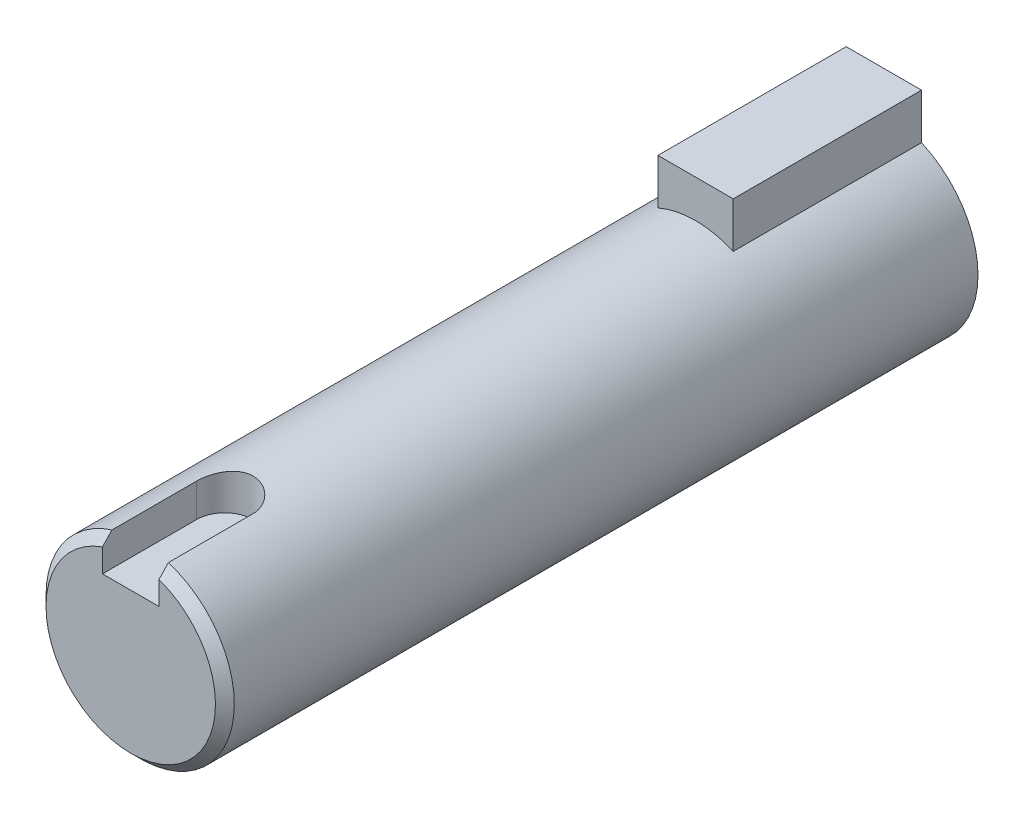
ISO-10303-21;
HEADER;
FILE_DESCRIPTION(('STEP AP214'),'2;1');
FILE_NAME('part.step','',(''),(''),'','','');
FILE_SCHEMA(('AUTOMOTIVE_DESIGN { 1 0 10303 214 1 1 1 1 }'));
ENDSEC;
DATA;
#1=APPLICATION_CONTEXT('core data for automotive mechanical design processes');
#2=APPLICATION_PROTOCOL_DEFINITION('international standard','automotive_design',2000,#1);
#3=PRODUCT_CONTEXT('',#1,'mechanical');
#4=PRODUCT('Part','Part','',(#3));
#5=PRODUCT_RELATED_PRODUCT_CATEGORY('part','',(#4));
#6=PRODUCT_DEFINITION_FORMATION('','',#4);
#7=PRODUCT_DEFINITION_CONTEXT('part definition',#1,'design');
#8=PRODUCT_DEFINITION('design','',#6,#7);
#9=PRODUCT_DEFINITION_SHAPE('','',#8);
#10=(LENGTH_UNIT() NAMED_UNIT(*) SI_UNIT(.MILLI.,.METRE.));
#11=(NAMED_UNIT(*) PLANE_ANGLE_UNIT() SI_UNIT($,.RADIAN.));
#12=(NAMED_UNIT(*) SI_UNIT($,.STERADIAN.) SOLID_ANGLE_UNIT());
#13=UNCERTAINTY_MEASURE_WITH_UNIT(LENGTH_MEASURE(1.E-05),#10,'distance_accuracy_value','');
#14=(GEOMETRIC_REPRESENTATION_CONTEXT(3) GLOBAL_UNCERTAINTY_ASSIGNED_CONTEXT((#13)) GLOBAL_UNIT_ASSIGNED_CONTEXT((#10,
#11,#12)) REPRESENTATION_CONTEXT('',''));
#15=CARTESIAN_POINT('',(0.,0.,0.));
#16=DIRECTION('',(0.,0.,1.));
#17=DIRECTION('',(1.,0.,0.));
#18=AXIS2_PLACEMENT_3D('',#15,#16,#17);
#19=CARTESIAN_POINT('',(0.,0.,10.));
#20=DIRECTION('',(0.,0.,-1.));
#21=DIRECTION('',(-1.,0.,0.));
#22=AXIS2_PLACEMENT_3D('',#19,#20,#21);
#23=CYLINDRICAL_SURFACE('',#22,5.);
#24=CARTESIAN_POINT('',(0.,0.,0.));
#25=DIRECTION('',(0.,0.,1.));
#26=DIRECTION('',(1.,0.,0.));
#27=AXIS2_PLACEMENT_3D('',#24,#25,#26);
#28=CIRCLE('',#27,5.);
#29=CARTESIAN_POINT('',(-2.,4.58257569495584,0.));
#30=VERTEX_POINT('',#29);
#31=CARTESIAN_POINT('',(2.,4.58257569495584,0.));
#32=VERTEX_POINT('',#31);
#33=EDGE_CURVE('E167',#30,#32,#28,.T.);
#34=ORIENTED_EDGE('',*,*,#33,.T.);
#35=DIRECTION('',(0.,0.,-1.));
#36=VECTOR('',#35,1.);
#37=CARTESIAN_POINT('',(2.,4.58257569495584,10.));
#38=LINE('',#37,#36);
#39=CARTESIAN_POINT('',(2.,4.58257569495584,10.));
#40=VERTEX_POINT('',#39);
#41=EDGE_CURVE('E177',#40,#32,#38,.T.);
#42=ORIENTED_EDGE('',*,*,#41,.F.);
#43=CARTESIAN_POINT('',(0.,0.,10.));
#44=DIRECTION('',(0.,0.,1.));
#45=DIRECTION('',(1.,0.,0.));
#46=AXIS2_PLACEMENT_3D('',#43,#44,#45);
#47=CIRCLE('',#46,5.);
#48=CARTESIAN_POINT('',(-2.,4.58257569495584,10.));
#49=VERTEX_POINT('',#48);
#50=EDGE_CURVE('E153',#40,#49,#47,.T.);
#51=ORIENTED_EDGE('',*,*,#50,.T.);
#52=DIRECTION('',(0.,0.,-1.));
#53=VECTOR('',#52,1.);
#54=CARTESIAN_POINT('',(-2.,4.58257569495584,10.));
#55=LINE('',#54,#53);
#56=EDGE_CURVE('E136',#49,#30,#55,.T.);
#57=ORIENTED_EDGE('',*,*,#56,.T.);
#58=EDGE_LOOP('',(#34,#42,#51,#57));
#59=FACE_BOUND('',#58,.T.);
#60=DIRECTION('',(0.,0.,-1.));
#61=VECTOR('',#60,1.);
#62=CARTESIAN_POINT('',(1.5,4.76969600708473,10.));
#63=LINE('',#62,#61);
#64=CARTESIAN_POINT('',(1.5,4.76969600708473,39.5));
#65=VERTEX_POINT('',#64);
#66=CARTESIAN_POINT('',(1.5,4.76969600708473,35.));
#67=VERTEX_POINT('',#66);
#68=EDGE_CURVE('E151',#65,#67,#63,.T.);
#69=ORIENTED_EDGE('',*,*,#68,.F.);
#70=CARTESIAN_POINT('',(0.,0.,39.5));
#71=DIRECTION('',(0.,0.,1.));
#72=DIRECTION('',(1.,0.,0.));
#73=AXIS2_PLACEMENT_3D('',#70,#71,#72);
#74=CIRCLE('',#73,5.);
#75=CARTESIAN_POINT('',(-1.5,4.76969600708473,39.5));
#76=VERTEX_POINT('',#75);
#77=EDGE_CURVE('E54',#65,#76,#74,.F.);
#78=ORIENTED_EDGE('',*,*,#77,.T.);
#79=DIRECTION('',(0.,0.,-1.));
#80=VECTOR('',#79,1.);
#81=CARTESIAN_POINT('',(-1.5,4.76969600708473,10.));
#82=LINE('',#81,#80);
#83=CARTESIAN_POINT('',(-1.5,4.76969600708473,35.));
#84=VERTEX_POINT('',#83);
#85=EDGE_CURVE('E149',#84,#76,#82,.F.);
#86=ORIENTED_EDGE('',*,*,#85,.F.);
#87=CARTESIAN_POINT('',(1.5,4.76969600708473,35.));
#88=CARTESIAN_POINT('',(1.50000085357071,4.76969249084934,34.958820607092));
#89=CARTESIAN_POINT('',(1.49830317083428,4.77022997000129,34.9176619568739));
#90=CARTESIAN_POINT('',(1.49153785660317,4.77235095109999,34.8356588379044));
#91=CARTESIAN_POINT('',(1.48647098275841,4.77393421787376,34.7948143006051));
#92=CARTESIAN_POINT('',(1.46630203689311,4.78018490618873,34.6734094590453));
#93=CARTESIAN_POINT('',(1.44623120413662,4.78635370384275,34.5936936095836));
#94=CARTESIAN_POINT('',(1.39353102315626,4.80195952113208,34.4389644216141));
#95=CARTESIAN_POINT('',(1.36090607068203,4.81139539670393,34.3639494478019));
#96=CARTESIAN_POINT('',(1.28407841117656,4.83246571212052,34.2204033184024));
#97=CARTESIAN_POINT('',(1.23987031651226,4.84410117434933,34.1518752002716));
#98=CARTESIAN_POINT('',(1.13964850658326,4.86866835244721,34.021133944003));
#99=CARTESIAN_POINT('',(1.08333433465208,4.88162755412974,33.9591563396566));
#100=CARTESIAN_POINT('',(0.961138919873354,4.90714811559049,33.8453644161));
#101=CARTESIAN_POINT('',(0.895256063916348,4.91970940785249,33.7935518139969));
#102=CARTESIAN_POINT('',(0.754109921315429,4.94333239727705,33.7005362296815));
#103=CARTESIAN_POINT('',(0.678680819336258,4.95435770971354,33.659574819702));
#104=CARTESIAN_POINT('',(0.521621185505772,4.97334469846208,33.5910115883818));
#105=CARTESIAN_POINT('',(0.439992259012925,4.98130716463903,33.5634063222057));
#106=CARTESIAN_POINT('',(0.275324697874875,4.99307639935002,33.523120200898));
#107=CARTESIAN_POINT('',(0.192393125294251,4.99699549276993,33.5100351420303));
#108=CARTESIAN_POINT('',(0.02542357199808,5.00063202022426,33.4978826586367));
#109=CARTESIAN_POINT('',(-0.0586141962423638,5.00035024971471,33.4988125802998));
#110=CARTESIAN_POINT('',(-0.222571599946018,4.99569602566267,33.514392908759));
#111=CARTESIAN_POINT('',(-0.302537145464643,4.99145415509187,33.5286053449787));
#112=CARTESIAN_POINT('',(-0.458890052102027,4.9795151369998,33.5696316352381));
#113=CARTESIAN_POINT('',(-0.535277225531999,4.97181780846028,33.5964461494559));
#114=CARTESIAN_POINT('',(-0.683347815892216,4.95365214926145,33.6622122216464));
#115=CARTESIAN_POINT('',(-0.754966006044142,4.94315255692525,33.7013016443569));
#116=CARTESIAN_POINT('',(-0.89076552957442,4.92049624651755,33.7903985900483));
#117=CARTESIAN_POINT('',(-0.954945191614595,4.90833915735884,33.8404085594788));
#118=CARTESIAN_POINT('',(-1.07665450541275,4.88311673571409,33.9521919880835));
#119=CARTESIAN_POINT('',(-1.13383351478034,4.87003445449554,34.0143438637607));
#120=CARTESIAN_POINT('',(-1.23706769492487,4.84484215114658,34.1474974234279));
#121=CARTESIAN_POINT('',(-1.28311962013078,4.83273241337565,34.2185016803655));
#122=CARTESIAN_POINT('',(-1.36316407240863,4.81077228795653,34.3682809284493));
#123=CARTESIAN_POINT('',(-1.39703006341135,4.80094596245948,34.4471271795934));
#124=CARTESIAN_POINT('',(-1.45085886004699,4.78495663653201,34.6097245039817));
#125=CARTESIAN_POINT('',(-1.47084293218036,4.77878803475875,34.6934678607144));
#126=CARTESIAN_POINT('',(-1.4890120359008,4.77314032325006,34.8149948890702));
#127=CARTESIAN_POINT('',(-1.49313202989009,4.77185156275267,34.8518907341796));
#128=CARTESIAN_POINT('',(-1.49862355614854,4.77012928611782,34.9258514790995));
#129=CARTESIAN_POINT('',(-1.49999912968269,4.76969451246644,34.9629160496639));
#130=CARTESIAN_POINT('',(-1.5,4.76969600708473,35.));
#131=B_SPLINE_CURVE_WITH_KNOTS('',3,(#87,#88,#89,#90,#91,#92,#93,#94,#95,#96,#97,#98,#99,#100,
#101,#102,#103,#104,#105,#106,#107,#108,#109,#110,#111,#112,#113,#114,#115,#116,#117,#118,#119,
#120,#121,#122,#123,#124,#125,#126,#127,#128,#129,#130),.UNSPECIFIED.,.F.,.F.,(4,2,2,2,2,2,2,2,
2,2,2,2,2,2,2,2,2,2,2,2,2,4),(0.,0.123459071219744,0.246890388853047,0.492911349615212,
0.738846245884322,0.984895736828089,1.23795510798803,1.49105719006936,1.74939356197455,
2.00766326783256,2.25854751319802,2.5093842528947,2.75223130012966,2.99509107067836,
3.2407824256273,3.48652887757005,3.74172568310981,3.99699683536778,4.25484698071527,
4.51230123440207,4.62365084745809,4.73483637253615),.UNSPECIFIED.);
#132=EDGE_CURVE('E124',#67,#84,#131,.T.);
#133=ORIENTED_EDGE('',*,*,#132,.F.);
#134=EDGE_LOOP('',(#69,#78,#86,#133));
#135=FACE_BOUND('',#134,.T.);
#136=ADVANCED_FACE('F39',(#59,#135),#23,.T.);
#137=CARTESIAN_POINT('',(0.,0.,40.));
#138=DIRECTION('',(0.,0.,1.));
#139=DIRECTION('',(1.,0.,0.));
#140=AXIS2_PLACEMENT_3D('',#137,#138,#139);
#141=PLANE('',#140);
#142=DIRECTION('',(0.,1.,0.));
#143=VECTOR('',#142,1.);
#144=CARTESIAN_POINT('',(-1.5,0.,40.));
#145=LINE('',#144,#143);
#146=CARTESIAN_POINT('',(-1.5,3.,40.));
#147=VERTEX_POINT('',#146);
#148=CARTESIAN_POINT('',(-1.5,4.24264068711929,40.));
#149=VERTEX_POINT('',#148);
#150=EDGE_CURVE('E125',#147,#149,#145,.T.);
#151=ORIENTED_EDGE('',*,*,#150,.T.);
#152=CARTESIAN_POINT('',(0.,0.,40.));
#153=DIRECTION('',(0.,0.,1.));
#154=DIRECTION('',(1.,0.,0.));
#155=AXIS2_PLACEMENT_3D('',#152,#153,#154);
#156=CIRCLE('',#155,4.5);
#157=CARTESIAN_POINT('',(1.5,4.24264068711929,40.));
#158=VERTEX_POINT('',#157);
#159=EDGE_CURVE('E122',#149,#158,#156,.T.);
#160=ORIENTED_EDGE('',*,*,#159,.T.);
#161=DIRECTION('',(0.,-1.,0.));
#162=VECTOR('',#161,1.);
#163=CARTESIAN_POINT('',(1.5,0.,40.));
#164=LINE('',#163,#162);
#165=CARTESIAN_POINT('',(1.5,3.,40.));
#166=VERTEX_POINT('',#165);
#167=EDGE_CURVE('E116',#158,#166,#164,.T.);
#168=ORIENTED_EDGE('',*,*,#167,.T.);
#169=DIRECTION('',(-1.,0.,0.));
#170=VECTOR('',#169,1.);
#171=CARTESIAN_POINT('',(0.,3.,40.));
#172=LINE('',#171,#170);
#173=EDGE_CURVE('E120',#166,#147,#172,.T.);
#174=ORIENTED_EDGE('',*,*,#173,.T.);
#175=EDGE_LOOP('',(#151,#160,#168,#174));
#176=FACE_BOUND('',#175,.T.);
#177=ADVANCED_FACE('F119',(#176),#141,.T.);
#178=CARTESIAN_POINT('',(-2.,7.,10.));
#179=DIRECTION('',(1.,0.,0.));
#180=DIRECTION('',(0.,0.,-1.));
#181=AXIS2_PLACEMENT_3D('',#178,#179,#180);
#182=PLANE('',#181);
#183=DIRECTION('',(0.,-1.,0.));
#184=VECTOR('',#183,1.);
#185=CARTESIAN_POINT('',(-2.,7.,0.));
#186=LINE('',#185,#184);
#187=CARTESIAN_POINT('',(-2.,7.,0.));
#188=VERTEX_POINT('',#187);
#189=EDGE_CURVE('E156',#188,#30,#186,.T.);
#190=ORIENTED_EDGE('',*,*,#189,.T.);
#191=ORIENTED_EDGE('',*,*,#56,.F.);
#192=DIRECTION('',(0.,-1.,0.));
#193=VECTOR('',#192,1.);
#194=CARTESIAN_POINT('',(-2.,7.,10.));
#195=LINE('',#194,#193);
#196=CARTESIAN_POINT('',(-2.,7.,10.));
#197=VERTEX_POINT('',#196);
#198=EDGE_CURVE('E157',#197,#49,#195,.T.);
#199=ORIENTED_EDGE('',*,*,#198,.F.);
#200=DIRECTION('',(0.,0.,-1.));
#201=VECTOR('',#200,1.);
#202=CARTESIAN_POINT('',(-2.,7.,10.));
#203=LINE('',#202,#201);
#204=EDGE_CURVE('E164',#197,#188,#203,.T.);
#205=ORIENTED_EDGE('',*,*,#204,.T.);
#206=EDGE_LOOP('',(#190,#191,#199,#205));
#207=FACE_BOUND('',#206,.T.);
#208=ADVANCED_FACE('F211',(#207),#182,.F.);
#209=CARTESIAN_POINT('',(2.,7.,10.));
#210=DIRECTION('',(-1.,0.,0.));
#211=DIRECTION('',(0.,0.,1.));
#212=AXIS2_PLACEMENT_3D('',#209,#210,#211);
#213=PLANE('',#212);
#214=DIRECTION('',(0.,1.,0.));
#215=VECTOR('',#214,1.);
#216=CARTESIAN_POINT('',(2.,7.,0.));
#217=LINE('',#216,#215);
#218=CARTESIAN_POINT('',(2.,7.,0.));
#219=VERTEX_POINT('',#218);
#220=EDGE_CURVE('E169',#32,#219,#217,.T.);
#221=ORIENTED_EDGE('',*,*,#220,.T.);
#222=DIRECTION('',(0.,0.,-1.));
#223=VECTOR('',#222,1.);
#224=CARTESIAN_POINT('',(2.,7.,10.));
#225=LINE('',#224,#223);
#226=CARTESIAN_POINT('',(2.,7.,10.));
#227=VERTEX_POINT('',#226);
#228=EDGE_CURVE('E174',#227,#219,#225,.T.);
#229=ORIENTED_EDGE('',*,*,#228,.F.);
#230=DIRECTION('',(0.,1.,0.));
#231=VECTOR('',#230,1.);
#232=CARTESIAN_POINT('',(2.,7.,10.));
#233=LINE('',#232,#231);
#234=EDGE_CURVE('E159',#40,#227,#233,.T.);
#235=ORIENTED_EDGE('',*,*,#234,.F.);
#236=ORIENTED_EDGE('',*,*,#41,.T.);
#237=EDGE_LOOP('',(#221,#229,#235,#236));
#238=FACE_BOUND('',#237,.T.);
#239=ADVANCED_FACE('F221',(#238),#213,.F.);
#240=CARTESIAN_POINT('',(-2.,7.,10.));
#241=DIRECTION('',(0.,-1.,0.));
#242=DIRECTION('',(0.,0.,-1.));
#243=AXIS2_PLACEMENT_3D('',#240,#241,#242);
#244=PLANE('',#243);
#245=DIRECTION('',(-1.,0.,0.));
#246=VECTOR('',#245,1.);
#247=CARTESIAN_POINT('',(-2.,7.,0.));
#248=LINE('',#247,#246);
#249=EDGE_CURVE('E160',#219,#188,#248,.T.);
#250=ORIENTED_EDGE('',*,*,#249,.T.);
#251=ORIENTED_EDGE('',*,*,#204,.F.);
#252=DIRECTION('',(-1.,0.,0.));
#253=VECTOR('',#252,1.);
#254=CARTESIAN_POINT('',(-2.,7.,10.));
#255=LINE('',#254,#253);
#256=EDGE_CURVE('E162',#227,#197,#255,.T.);
#257=ORIENTED_EDGE('',*,*,#256,.F.);
#258=ORIENTED_EDGE('',*,*,#228,.T.);
#259=EDGE_LOOP('',(#250,#251,#257,#258));
#260=FACE_BOUND('',#259,.T.);
#261=ADVANCED_FACE('F215',(#260),#244,.F.);
#262=CARTESIAN_POINT('',(0.,0.,10.));
#263=DIRECTION('',(0.,0.,1.));
#264=DIRECTION('',(1.,0.,0.));
#265=AXIS2_PLACEMENT_3D('',#262,#263,#264);
#266=PLANE('',#265);
#267=ORIENTED_EDGE('',*,*,#50,.F.);
#268=ORIENTED_EDGE('',*,*,#234,.T.);
#269=ORIENTED_EDGE('',*,*,#256,.T.);
#270=ORIENTED_EDGE('',*,*,#198,.T.);
#271=EDGE_LOOP('',(#267,#268,#269,#270));
#272=FACE_BOUND('',#271,.T.);
#273=ADVANCED_FACE('F212',(#272),#266,.T.);
#274=CARTESIAN_POINT('',(0.,0.,0.));
#275=DIRECTION('',(0.,0.,1.));
#276=DIRECTION('',(1.,0.,0.));
#277=AXIS2_PLACEMENT_3D('',#274,#275,#276);
#278=PLANE('',#277);
#279=ORIENTED_EDGE('',*,*,#189,.F.);
#280=ORIENTED_EDGE('',*,*,#249,.F.);
#281=ORIENTED_EDGE('',*,*,#220,.F.);
#282=ORIENTED_EDGE('',*,*,#33,.F.);
#283=EDGE_LOOP('',(#279,#280,#281,#282));
#284=FACE_BOUND('',#283,.T.);
#285=ADVANCED_FACE('F197',(#284),#278,.F.);
#286=CARTESIAN_POINT('',(0.,7.,35.));
#287=DIRECTION('',(0.,-1.,0.));
#288=DIRECTION('',(0.,0.,-1.));
#289=AXIS2_PLACEMENT_3D('',#286,#287,#288);
#290=CYLINDRICAL_SURFACE('',#289,1.5);
#291=ORIENTED_EDGE('',*,*,#132,.T.);
#292=DIRECTION('',(0.,-1.,0.));
#293=VECTOR('',#292,1.);
#294=CARTESIAN_POINT('',(-1.5,7.,35.));
#295=LINE('',#294,#293);
#296=CARTESIAN_POINT('',(-1.5,3.,35.));
#297=VERTEX_POINT('',#296);
#298=EDGE_CURVE('E146',#84,#297,#295,.T.);
#299=ORIENTED_EDGE('',*,*,#298,.T.);
#300=CARTESIAN_POINT('',(0.,3.,35.));
#301=DIRECTION('',(0.,1.,0.));
#302=DIRECTION('',(0.,0.,1.));
#303=AXIS2_PLACEMENT_3D('',#300,#301,#302);
#304=CIRCLE('',#303,1.5);
#305=CARTESIAN_POINT('',(1.5,3.,35.));
#306=VERTEX_POINT('',#305);
#307=EDGE_CURVE('E141',#306,#297,#304,.T.);
#308=ORIENTED_EDGE('',*,*,#307,.F.);
#309=DIRECTION('',(0.,-1.,0.));
#310=VECTOR('',#309,1.);
#311=CARTESIAN_POINT('',(1.5,7.,35.));
#312=LINE('',#311,#310);
#313=EDGE_CURVE('E140',#67,#306,#312,.T.);
#314=ORIENTED_EDGE('',*,*,#313,.F.);
#315=EDGE_LOOP('',(#291,#299,#308,#314));
#316=FACE_BOUND('',#315,.T.);
#317=ADVANCED_FACE('F193',(#316),#290,.F.);
#318=CARTESIAN_POINT('',(1.5,7.,40.));
#319=DIRECTION('',(-1.,0.,0.));
#320=DIRECTION('',(0.,0.,1.));
#321=AXIS2_PLACEMENT_3D('',#318,#319,#320);
#322=PLANE('',#321);
#323=ORIENTED_EDGE('',*,*,#167,.F.);
#324=CARTESIAN_POINT('',(1.5,4.24264068711929,40.));
#325=CARTESIAN_POINT('',(1.5,4.33072666160121,39.9169232397423));
#326=CARTESIAN_POINT('',(1.5,4.4186909304237,39.8337181882542));
#327=CARTESIAN_POINT('',(1.5,4.59437603702419,39.6670515215299));
#328=CARTESIAN_POINT('',(1.5,4.68209687485685,39.5835899063514));
#329=CARTESIAN_POINT('',(1.5,4.76969600708473,39.5));
#330=B_SPLINE_CURVE_WITH_KNOTS('',3,(#324,#325,#326,#327,#328,#329),.UNSPECIFIED.,.F.,.F.,(4,2,
4),(0.,0.363245287159552,0.726490492749918),.UNSPECIFIED.);
#331=EDGE_CURVE('E68',#158,#65,#330,.T.);
#332=ORIENTED_EDGE('',*,*,#331,.T.);
#333=ORIENTED_EDGE('',*,*,#68,.T.);
#334=ORIENTED_EDGE('',*,*,#313,.T.);
#335=DIRECTION('',(0.,0.,-1.));
#336=VECTOR('',#335,1.);
#337=CARTESIAN_POINT('',(1.5,3.,40.));
#338=LINE('',#337,#336);
#339=EDGE_CURVE('E131',#166,#306,#338,.T.);
#340=ORIENTED_EDGE('',*,*,#339,.F.);
#341=EDGE_LOOP('',(#323,#332,#333,#334,#340));
#342=FACE_BOUND('',#341,.T.);
#343=ADVANCED_FACE('F138',(#342),#322,.T.);
#344=CARTESIAN_POINT('',(-1.5,7.,40.));
#345=DIRECTION('',(1.,0.,0.));
#346=DIRECTION('',(0.,0.,-1.));
#347=AXIS2_PLACEMENT_3D('',#344,#345,#346);
#348=PLANE('',#347);
#349=ORIENTED_EDGE('',*,*,#85,.T.);
#350=CARTESIAN_POINT('',(-1.5,4.76969600708473,39.5));
#351=CARTESIAN_POINT('',(-1.5,4.68209687485685,39.5835899063514));
#352=CARTESIAN_POINT('',(-1.5,4.59437603702419,39.6670515215299));
#353=CARTESIAN_POINT('',(-1.5,4.4186909304237,39.8337181882542));
#354=CARTESIAN_POINT('',(-1.5,4.33072666160121,39.9169232397423));
#355=CARTESIAN_POINT('',(-1.5,4.24264068711929,40.));
#356=B_SPLINE_CURVE_WITH_KNOTS('',3,(#350,#351,#352,#353,#354,#355),.UNSPECIFIED.,.F.,.F.,(4,2,
4),(0.,0.363245205590365,0.726490492749917),.UNSPECIFIED.);
#357=EDGE_CURVE('E11',#76,#149,#356,.T.);
#358=ORIENTED_EDGE('',*,*,#357,.T.);
#359=ORIENTED_EDGE('',*,*,#150,.F.);
#360=DIRECTION('',(0.,0.,1.));
#361=VECTOR('',#360,1.);
#362=CARTESIAN_POINT('',(-1.5,3.,40.));
#363=LINE('',#362,#361);
#364=EDGE_CURVE('E134',#297,#147,#363,.T.);
#365=ORIENTED_EDGE('',*,*,#364,.F.);
#366=ORIENTED_EDGE('',*,*,#298,.F.);
#367=EDGE_LOOP('',(#349,#358,#359,#365,#366));
#368=FACE_BOUND('',#367,.T.);
#369=ADVANCED_FACE('F199',(#368),#348,.T.);
#370=CARTESIAN_POINT('',(0.,3.,40.));
#371=DIRECTION('',(0.,1.,0.));
#372=DIRECTION('',(0.,0.,1.));
#373=AXIS2_PLACEMENT_3D('',#370,#371,#372);
#374=PLANE('',#373);
#375=ORIENTED_EDGE('',*,*,#339,.T.);
#376=ORIENTED_EDGE('',*,*,#307,.T.);
#377=ORIENTED_EDGE('',*,*,#364,.T.);
#378=ORIENTED_EDGE('',*,*,#173,.F.);
#379=EDGE_LOOP('',(#375,#376,#377,#378));
#380=FACE_BOUND('',#379,.T.);
#381=ADVANCED_FACE('F129',(#380),#374,.T.);
#382=CARTESIAN_POINT('',(0.,0.,40.));
#383=DIRECTION('',(0.,0.,-1.));
#384=DIRECTION('',(-1.,0.,0.));
#385=AXIS2_PLACEMENT_3D('',#382,#383,#384);
#386=CONICAL_SURFACE('',#385,4.5,0.785398163397458);
#387=ORIENTED_EDGE('',*,*,#357,.F.);
#388=ORIENTED_EDGE('',*,*,#77,.F.);
#389=ORIENTED_EDGE('',*,*,#331,.F.);
#390=ORIENTED_EDGE('',*,*,#159,.F.);
#391=EDGE_LOOP('',(#387,#388,#389,#390));
#392=FACE_BOUND('',#391,.T.);
#393=ADVANCED_FACE('F42',(#392),#386,.T.);
#394=CLOSED_SHELL('',(#136,#177,#208,#239,#261,#273,#285,#317,#343,#369,#381,#393));
#395=MANIFOLD_SOLID_BREP('B2',#394);
#396=ADVANCED_BREP_SHAPE_REPRESENTATION('',(#18,#395),#14);
#397=SHAPE_DEFINITION_REPRESENTATION(#9,#396);
ENDSEC;
END-ISO-10303-21;
